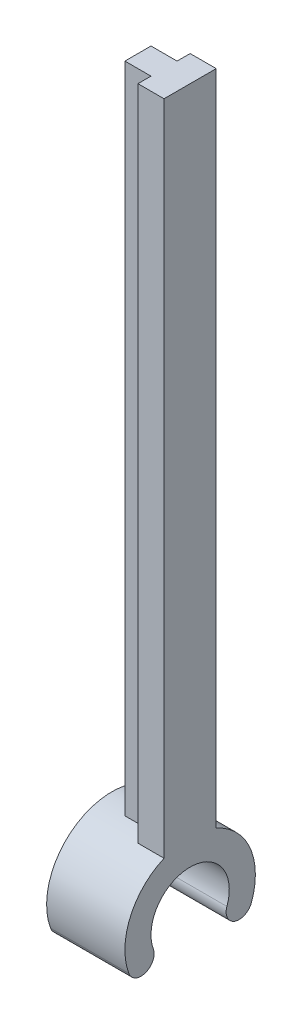
ISO-10303-21;
HEADER;
FILE_DESCRIPTION(('STEP AP214'),'2;1');
FILE_NAME('part.step','',(''),(''),'','','');
FILE_SCHEMA(('AUTOMOTIVE_DESIGN { 1 0 10303 214 1 1 1 1 }'));
ENDSEC;
DATA;
#1=APPLICATION_CONTEXT('core data for automotive mechanical design processes');
#2=APPLICATION_PROTOCOL_DEFINITION('international standard','automotive_design',2000,#1);
#3=PRODUCT_CONTEXT('',#1,'mechanical');
#4=PRODUCT('Part','Part','',(#3));
#5=PRODUCT_RELATED_PRODUCT_CATEGORY('part','',(#4));
#6=PRODUCT_DEFINITION_FORMATION('','',#4);
#7=PRODUCT_DEFINITION_CONTEXT('part definition',#1,'design');
#8=PRODUCT_DEFINITION('design','',#6,#7);
#9=PRODUCT_DEFINITION_SHAPE('','',#8);
#10=(LENGTH_UNIT() NAMED_UNIT(*) SI_UNIT(.MILLI.,.METRE.));
#11=(NAMED_UNIT(*) PLANE_ANGLE_UNIT() SI_UNIT($,.RADIAN.));
#12=(NAMED_UNIT(*) SI_UNIT($,.STERADIAN.) SOLID_ANGLE_UNIT());
#13=UNCERTAINTY_MEASURE_WITH_UNIT(LENGTH_MEASURE(1.E-05),#10,'distance_accuracy_value','');
#14=(GEOMETRIC_REPRESENTATION_CONTEXT(3) GLOBAL_UNCERTAINTY_ASSIGNED_CONTEXT((#13)) GLOBAL_UNIT_ASSIGNED_CONTEXT((#10,
#11,#12)) REPRESENTATION_CONTEXT('',''));
#15=CARTESIAN_POINT('',(0.,0.,0.));
#16=DIRECTION('',(0.,0.,1.));
#17=DIRECTION('',(1.,0.,0.));
#18=AXIS2_PLACEMENT_3D('',#15,#16,#17);
#19=CARTESIAN_POINT('',(2.,0.,0.));
#20=DIRECTION('',(-1.,0.,0.));
#21=DIRECTION('',(0.,0.,1.));
#22=AXIS2_PLACEMENT_3D('',#19,#20,#21);
#23=CYLINDRICAL_SURFACE('',#22,5.);
#24=DIRECTION('',(-1.,0.,0.));
#25=VECTOR('',#24,1.);
#26=CARTESIAN_POINT('',(2.,4.89897948556635,-1.00000000000001));
#27=LINE('',#26,#25);
#28=CARTESIAN_POINT('',(0.,4.89897948556635,-1.00000000000001));
#29=VERTEX_POINT('',#28);
#30=CARTESIAN_POINT('',(-2.,4.89897948556635,-1.00000000000001));
#31=VERTEX_POINT('',#30);
#32=EDGE_CURVE('E155',#29,#31,#27,.T.);
#33=ORIENTED_EDGE('',*,*,#32,.F.);
#34=CARTESIAN_POINT('',(0.,0.,0.));
#35=DIRECTION('',(1.,0.,0.));
#36=DIRECTION('',(0.,0.,-1.));
#37=AXIS2_PLACEMENT_3D('',#34,#35,#36);
#38=CIRCLE('',#37,5.);
#39=CARTESIAN_POINT('',(0.,4.58257569495584,-2.));
#40=VERTEX_POINT('',#39);
#41=EDGE_CURVE('E11',#40,#29,#38,.T.);
#42=ORIENTED_EDGE('',*,*,#41,.F.);
#43=DIRECTION('',(-1.,0.,0.));
#44=VECTOR('',#43,1.);
#45=CARTESIAN_POINT('',(2.,4.58257569495584,-2.));
#46=LINE('',#45,#44);
#47=CARTESIAN_POINT('',(2.,4.58257569495584,-2.));
#48=VERTEX_POINT('',#47);
#49=EDGE_CURVE('E206',#48,#40,#46,.T.);
#50=ORIENTED_EDGE('',*,*,#49,.F.);
#51=CARTESIAN_POINT('',(2.,0.,0.));
#52=DIRECTION('',(1.,0.,0.));
#53=DIRECTION('',(0.,0.,-1.));
#54=AXIS2_PLACEMENT_3D('',#51,#52,#53);
#55=CIRCLE('',#54,5.);
#56=CARTESIAN_POINT('',(2.,-1.71010071662835,-4.69846310392954));
#57=VERTEX_POINT('',#56);
#58=EDGE_CURVE('E234',#57,#48,#55,.T.);
#59=ORIENTED_EDGE('',*,*,#58,.F.);
#60=DIRECTION('',(-1.,0.,0.));
#61=VECTOR('',#60,1.);
#62=CARTESIAN_POINT('',(2.,-1.71010071662835,-4.69846310392954));
#63=LINE('',#62,#61);
#64=CARTESIAN_POINT('',(-4.,-1.71010071662835,-4.69846310392954));
#65=VERTEX_POINT('',#64);
#66=EDGE_CURVE('E248',#57,#65,#63,.T.);
#67=ORIENTED_EDGE('',*,*,#66,.T.);
#68=CARTESIAN_POINT('',(-4.,0.,0.));
#69=DIRECTION('',(1.,0.,0.));
#70=DIRECTION('',(0.,0.,-1.));
#71=AXIS2_PLACEMENT_3D('',#68,#69,#70);
#72=CIRCLE('',#71,5.);
#73=CARTESIAN_POINT('',(-4.,-1.71010071662835,4.69846310392954));
#74=VERTEX_POINT('',#73);
#75=EDGE_CURVE('E218',#65,#74,#72,.T.);
#76=ORIENTED_EDGE('',*,*,#75,.T.);
#77=DIRECTION('',(-1.,0.,0.));
#78=VECTOR('',#77,1.);
#79=CARTESIAN_POINT('',(2.,-1.71010071662835,4.69846310392954));
#80=LINE('',#79,#78);
#81=CARTESIAN_POINT('',(2.,-1.71010071662835,4.69846310392954));
#82=VERTEX_POINT('',#81);
#83=EDGE_CURVE('E245',#82,#74,#80,.T.);
#84=ORIENTED_EDGE('',*,*,#83,.F.);
#85=CARTESIAN_POINT('',(2.,4.58257569495584,2.));
#86=VERTEX_POINT('',#85);
#87=EDGE_CURVE('E233',#86,#82,#55,.T.);
#88=ORIENTED_EDGE('',*,*,#87,.F.);
#89=DIRECTION('',(-1.,0.,0.));
#90=VECTOR('',#89,1.);
#91=CARTESIAN_POINT('',(2.,4.58257569495584,2.));
#92=LINE('',#91,#90);
#93=CARTESIAN_POINT('',(0.,4.58257569495584,2.));
#94=VERTEX_POINT('',#93);
#95=EDGE_CURVE('E202',#86,#94,#92,.T.);
#96=ORIENTED_EDGE('',*,*,#95,.T.);
#97=CARTESIAN_POINT('',(0.,4.89897948556636,0.999999999999994));
#98=VERTEX_POINT('',#97);
#99=EDGE_CURVE('E50',#98,#94,#38,.T.);
#100=ORIENTED_EDGE('',*,*,#99,.F.);
#101=DIRECTION('',(-1.,0.,0.));
#102=VECTOR('',#101,1.);
#103=CARTESIAN_POINT('',(2.,4.89897948556636,0.999999999999994));
#104=LINE('',#103,#102);
#105=CARTESIAN_POINT('',(-2.,4.89897948556636,0.999999999999994));
#106=VERTEX_POINT('',#105);
#107=EDGE_CURVE('E57',#98,#106,#104,.T.);
#108=ORIENTED_EDGE('',*,*,#107,.T.);
#109=CARTESIAN_POINT('',(-2.,0.,0.));
#110=DIRECTION('',(1.,0.,0.));
#111=DIRECTION('',(0.,0.,-1.));
#112=AXIS2_PLACEMENT_3D('',#109,#110,#111);
#113=CIRCLE('',#112,5.);
#114=EDGE_CURVE('E61',#31,#106,#113,.T.);
#115=ORIENTED_EDGE('',*,*,#114,.F.);
#116=EDGE_LOOP('',(#33,#42,#50,#59,#67,#76,#84,#88,#96,#100,#108,#115));
#117=FACE_BOUND('',#116,.T.);
#118=ADVANCED_FACE('F41',(#117),#23,.T.);
#119=CARTESIAN_POINT('',(0.,0.,0.));
#120=DIRECTION('',(1.,0.,0.));
#121=DIRECTION('',(0.,0.,-1.));
#122=AXIS2_PLACEMENT_3D('',#119,#120,#121);
#123=PLANE('',#122);
#124=DIRECTION('',(0.,-1.,0.));
#125=VECTOR('',#124,1.);
#126=CARTESIAN_POINT('',(0.,0.,-1.00000000000001));
#127=LINE('',#126,#125);
#128=CARTESIAN_POINT('',(0.,55.,-1.));
#129=VERTEX_POINT('',#128);
#130=EDGE_CURVE('E160',#129,#29,#127,.T.);
#131=ORIENTED_EDGE('',*,*,#130,.F.);
#132=DIRECTION('',(0.,0.,-1.));
#133=VECTOR('',#132,1.);
#134=CARTESIAN_POINT('',(0.,55.,0.));
#135=LINE('',#134,#133);
#136=CARTESIAN_POINT('',(0.,55.,-2.));
#137=VERTEX_POINT('',#136);
#138=EDGE_CURVE('E147',#129,#137,#135,.T.);
#139=ORIENTED_EDGE('',*,*,#138,.T.);
#140=DIRECTION('',(0.,1.,0.));
#141=VECTOR('',#140,1.);
#142=CARTESIAN_POINT('',(0.,0.,-2.));
#143=LINE('',#142,#141);
#144=EDGE_CURVE('E175',#40,#137,#143,.T.);
#145=ORIENTED_EDGE('',*,*,#144,.F.);
#146=ORIENTED_EDGE('',*,*,#41,.T.);
#147=EDGE_LOOP('',(#131,#139,#145,#146));
#148=FACE_BOUND('',#147,.T.);
#149=ADVANCED_FACE('F277',(#148),#123,.F.);
#150=CARTESIAN_POINT('',(2.,0.,0.));
#151=DIRECTION('',(-1.,0.,0.));
#152=DIRECTION('',(0.,0.,1.));
#153=AXIS2_PLACEMENT_3D('',#150,#151,#152);
#154=CYLINDRICAL_SURFACE('',#153,3.);
#155=DIRECTION('',(-1.,0.,0.));
#156=VECTOR('',#155,1.);
#157=CARTESIAN_POINT('',(2.,-1.02606042997701,2.81907786235773));
#158=LINE('',#157,#156);
#159=CARTESIAN_POINT('',(2.,-1.02606042997701,2.81907786235773));
#160=VERTEX_POINT('',#159);
#161=CARTESIAN_POINT('',(-4.,-1.02606042997701,2.81907786235773));
#162=VERTEX_POINT('',#161);
#163=EDGE_CURVE('E242',#160,#162,#158,.T.);
#164=ORIENTED_EDGE('',*,*,#163,.T.);
#165=CARTESIAN_POINT('',(-4.,0.,0.));
#166=DIRECTION('',(1.,0.,0.));
#167=DIRECTION('',(0.,0.,-1.));
#168=AXIS2_PLACEMENT_3D('',#165,#166,#167);
#169=CIRCLE('',#168,3.);
#170=CARTESIAN_POINT('',(-4.,-1.02606042997701,-2.81907786235773));
#171=VERTEX_POINT('',#170);
#172=EDGE_CURVE('E210',#171,#162,#169,.T.);
#173=ORIENTED_EDGE('',*,*,#172,.F.);
#174=DIRECTION('',(-1.,0.,0.));
#175=VECTOR('',#174,1.);
#176=CARTESIAN_POINT('',(2.,-1.02606042997701,-2.81907786235773));
#177=LINE('',#176,#175);
#178=CARTESIAN_POINT('',(2.,-1.02606042997701,-2.81907786235773));
#179=VERTEX_POINT('',#178);
#180=EDGE_CURVE('E250',#179,#171,#177,.T.);
#181=ORIENTED_EDGE('',*,*,#180,.F.);
#182=CARTESIAN_POINT('',(2.,0.,0.));
#183=DIRECTION('',(1.,0.,0.));
#184=DIRECTION('',(0.,0.,-1.));
#185=AXIS2_PLACEMENT_3D('',#182,#183,#184);
#186=CIRCLE('',#185,3.);
#187=EDGE_CURVE('E226',#179,#160,#186,.T.);
#188=ORIENTED_EDGE('',*,*,#187,.T.);
#189=EDGE_LOOP('',(#164,#173,#181,#188));
#190=FACE_BOUND('',#189,.T.);
#191=ADVANCED_FACE('F43',(#190),#154,.F.);
#192=CARTESIAN_POINT('',(2.,-1.36808057330268,-3.75877048314363));
#193=DIRECTION('',(-1.,0.,0.));
#194=DIRECTION('',(0.,0.,1.));
#195=AXIS2_PLACEMENT_3D('',#192,#193,#194);
#196=CYLINDRICAL_SURFACE('',#195,1.);
#197=ORIENTED_EDGE('',*,*,#180,.T.);
#198=CARTESIAN_POINT('',(-4.,-1.36808057330268,-3.75877048314363));
#199=DIRECTION('',(1.,0.,0.));
#200=DIRECTION('',(0.,0.,-1.));
#201=AXIS2_PLACEMENT_3D('',#198,#199,#200);
#202=CIRCLE('',#201,1.);
#203=EDGE_CURVE('E214',#65,#171,#202,.F.);
#204=ORIENTED_EDGE('',*,*,#203,.F.);
#205=ORIENTED_EDGE('',*,*,#66,.F.);
#206=CARTESIAN_POINT('',(2.,-1.36808057330268,-3.75877048314363));
#207=DIRECTION('',(1.,0.,0.));
#208=DIRECTION('',(0.,0.,-1.));
#209=AXIS2_PLACEMENT_3D('',#206,#207,#208);
#210=CIRCLE('',#209,1.);
#211=EDGE_CURVE('E229',#57,#179,#210,.F.);
#212=ORIENTED_EDGE('',*,*,#211,.T.);
#213=EDGE_LOOP('',(#197,#204,#205,#212));
#214=FACE_BOUND('',#213,.T.);
#215=ADVANCED_FACE('F287',(#214),#196,.T.);
#216=CARTESIAN_POINT('',(2.,-1.36808057330268,3.75877048314363));
#217=DIRECTION('',(-1.,0.,0.));
#218=DIRECTION('',(0.,0.,1.));
#219=AXIS2_PLACEMENT_3D('',#216,#217,#218);
#220=CYLINDRICAL_SURFACE('',#219,1.);
#221=ORIENTED_EDGE('',*,*,#83,.T.);
#222=CARTESIAN_POINT('',(-4.,-1.36808057330268,3.75877048314363));
#223=DIRECTION('',(1.,0.,0.));
#224=DIRECTION('',(0.,0.,-1.));
#225=AXIS2_PLACEMENT_3D('',#222,#223,#224);
#226=CIRCLE('',#225,1.);
#227=EDGE_CURVE('E222',#74,#162,#226,.T.);
#228=ORIENTED_EDGE('',*,*,#227,.T.);
#229=ORIENTED_EDGE('',*,*,#163,.F.);
#230=CARTESIAN_POINT('',(2.,-1.36808057330268,3.75877048314363));
#231=DIRECTION('',(1.,0.,0.));
#232=DIRECTION('',(0.,0.,-1.));
#233=AXIS2_PLACEMENT_3D('',#230,#231,#232);
#234=CIRCLE('',#233,1.);
#235=EDGE_CURVE('E238',#82,#160,#234,.T.);
#236=ORIENTED_EDGE('',*,*,#235,.F.);
#237=EDGE_LOOP('',(#221,#228,#229,#236));
#238=FACE_BOUND('',#237,.T.);
#239=ADVANCED_FACE('F285',(#238),#220,.T.);
#240=CARTESIAN_POINT('',(2.,0.,0.));
#241=DIRECTION('',(1.,0.,0.));
#242=DIRECTION('',(0.,0.,-1.));
#243=AXIS2_PLACEMENT_3D('',#240,#241,#242);
#244=PLANE('',#243);
#245=ORIENTED_EDGE('',*,*,#235,.T.);
#246=ORIENTED_EDGE('',*,*,#187,.F.);
#247=ORIENTED_EDGE('',*,*,#211,.F.);
#248=ORIENTED_EDGE('',*,*,#58,.T.);
#249=DIRECTION('',(0.,1.,0.));
#250=VECTOR('',#249,1.);
#251=CARTESIAN_POINT('',(2.,0.,-2.));
#252=LINE('',#251,#250);
#253=CARTESIAN_POINT('',(2.,55.,-2.));
#254=VERTEX_POINT('',#253);
#255=EDGE_CURVE('E176',#48,#254,#252,.T.);
#256=ORIENTED_EDGE('',*,*,#255,.T.);
#257=DIRECTION('',(0.,0.,-1.));
#258=VECTOR('',#257,1.);
#259=CARTESIAN_POINT('',(2.,55.,0.));
#260=LINE('',#259,#258);
#261=CARTESIAN_POINT('',(2.,55.,2.));
#262=VERTEX_POINT('',#261);
#263=EDGE_CURVE('E179',#262,#254,#260,.T.);
#264=ORIENTED_EDGE('',*,*,#263,.F.);
#265=DIRECTION('',(0.,1.,0.));
#266=VECTOR('',#265,1.);
#267=CARTESIAN_POINT('',(2.,0.,2.));
#268=LINE('',#267,#266);
#269=EDGE_CURVE('E184',#86,#262,#268,.T.);
#270=ORIENTED_EDGE('',*,*,#269,.F.);
#271=ORIENTED_EDGE('',*,*,#87,.T.);
#272=EDGE_LOOP('',(#245,#246,#247,#248,#256,#264,#270,#271));
#273=FACE_BOUND('',#272,.T.);
#274=ADVANCED_FACE('F293',(#273),#244,.T.);
#275=CARTESIAN_POINT('',(-4.,0.,0.));
#276=DIRECTION('',(1.,0.,0.));
#277=DIRECTION('',(0.,0.,-1.));
#278=AXIS2_PLACEMENT_3D('',#275,#276,#277);
#279=PLANE('',#278);
#280=ORIENTED_EDGE('',*,*,#172,.T.);
#281=ORIENTED_EDGE('',*,*,#227,.F.);
#282=ORIENTED_EDGE('',*,*,#75,.F.);
#283=ORIENTED_EDGE('',*,*,#203,.T.);
#284=EDGE_LOOP('',(#280,#281,#282,#283));
#285=FACE_BOUND('',#284,.T.);
#286=ADVANCED_FACE('F304',(#285),#279,.F.);
#287=CARTESIAN_POINT('',(2.,0.,-2.));
#288=DIRECTION('',(0.,0.,1.));
#289=DIRECTION('',(1.,0.,0.));
#290=AXIS2_PLACEMENT_3D('',#287,#288,#289);
#291=PLANE('',#290);
#292=ORIENTED_EDGE('',*,*,#255,.F.);
#293=ORIENTED_EDGE('',*,*,#49,.T.);
#294=ORIENTED_EDGE('',*,*,#144,.T.);
#295=DIRECTION('',(-1.,0.,0.));
#296=VECTOR('',#295,1.);
#297=CARTESIAN_POINT('',(2.,55.,-2.));
#298=LINE('',#297,#296);
#299=EDGE_CURVE('E199',#254,#137,#298,.T.);
#300=ORIENTED_EDGE('',*,*,#299,.F.);
#301=EDGE_LOOP('',(#292,#293,#294,#300));
#302=FACE_BOUND('',#301,.T.);
#303=ADVANCED_FACE('F315',(#302),#291,.F.);
#304=CARTESIAN_POINT('',(2.,0.,2.));
#305=DIRECTION('',(0.,0.,1.));
#306=DIRECTION('',(0.,-1.,0.));
#307=AXIS2_PLACEMENT_3D('',#304,#305,#306);
#308=PLANE('',#307);
#309=ORIENTED_EDGE('',*,*,#95,.F.);
#310=ORIENTED_EDGE('',*,*,#269,.T.);
#311=DIRECTION('',(-1.,0.,0.));
#312=VECTOR('',#311,1.);
#313=CARTESIAN_POINT('',(2.,55.,2.));
#314=LINE('',#313,#312);
#315=CARTESIAN_POINT('',(0.,55.,2.));
#316=VERTEX_POINT('',#315);
#317=EDGE_CURVE('E187',#262,#316,#314,.T.);
#318=ORIENTED_EDGE('',*,*,#317,.T.);
#319=DIRECTION('',(0.,1.,0.));
#320=VECTOR('',#319,1.);
#321=CARTESIAN_POINT('',(0.,0.,2.));
#322=LINE('',#321,#320);
#323=EDGE_CURVE('E180',#94,#316,#322,.T.);
#324=ORIENTED_EDGE('',*,*,#323,.F.);
#325=EDGE_LOOP('',(#309,#310,#318,#324));
#326=FACE_BOUND('',#325,.T.);
#327=ADVANCED_FACE('F263',(#326),#308,.T.);
#328=CARTESIAN_POINT('',(2.,55.,0.));
#329=DIRECTION('',(0.,1.,0.));
#330=DIRECTION('',(0.,0.,1.));
#331=AXIS2_PLACEMENT_3D('',#328,#329,#330);
#332=PLANE('',#331);
#333=CARTESIAN_POINT('',(0.,55.,1.));
#334=VERTEX_POINT('',#333);
#335=EDGE_CURVE('E191',#316,#334,#135,.T.);
#336=ORIENTED_EDGE('',*,*,#335,.F.);
#337=ORIENTED_EDGE('',*,*,#317,.F.);
#338=ORIENTED_EDGE('',*,*,#263,.T.);
#339=ORIENTED_EDGE('',*,*,#299,.T.);
#340=ORIENTED_EDGE('',*,*,#138,.F.);
#341=DIRECTION('',(1.,0.,0.));
#342=VECTOR('',#341,1.);
#343=CARTESIAN_POINT('',(-2.,55.,-1.));
#344=LINE('',#343,#342);
#345=CARTESIAN_POINT('',(-2.,55.,-1.));
#346=VERTEX_POINT('',#345);
#347=EDGE_CURVE('E143',#346,#129,#344,.T.);
#348=ORIENTED_EDGE('',*,*,#347,.F.);
#349=DIRECTION('',(0.,0.,-1.));
#350=VECTOR('',#349,1.);
#351=CARTESIAN_POINT('',(-2.,55.,0.));
#352=LINE('',#351,#350);
#353=CARTESIAN_POINT('',(-2.,55.,1.));
#354=VERTEX_POINT('',#353);
#355=EDGE_CURVE('E131',#354,#346,#352,.T.);
#356=ORIENTED_EDGE('',*,*,#355,.F.);
#357=DIRECTION('',(1.,0.,0.));
#358=VECTOR('',#357,1.);
#359=CARTESIAN_POINT('',(-2.,55.,1.));
#360=LINE('',#359,#358);
#361=EDGE_CURVE('E152',#354,#334,#360,.T.);
#362=ORIENTED_EDGE('',*,*,#361,.T.);
#363=EDGE_LOOP('',(#336,#337,#338,#339,#340,#348,#356,#362));
#364=FACE_BOUND('',#363,.T.);
#365=ADVANCED_FACE('F145',(#364),#332,.T.);
#366=ORIENTED_EDGE('',*,*,#335,.T.);
#367=DIRECTION('',(0.,-1.,0.));
#368=VECTOR('',#367,1.);
#369=CARTESIAN_POINT('',(0.,0.,0.999999999999993));
#370=LINE('',#369,#368);
#371=EDGE_CURVE('E157',#334,#98,#370,.T.);
#372=ORIENTED_EDGE('',*,*,#371,.T.);
#373=ORIENTED_EDGE('',*,*,#99,.T.);
#374=ORIENTED_EDGE('',*,*,#323,.T.);
#375=EDGE_LOOP('',(#366,#372,#373,#374));
#376=FACE_BOUND('',#375,.T.);
#377=ADVANCED_FACE('F256',(#376),#123,.F.);
#378=CARTESIAN_POINT('',(-2.,0.,-1.00000000000001));
#379=DIRECTION('',(0.,0.,1.));
#380=DIRECTION('',(0.,-1.,0.));
#381=AXIS2_PLACEMENT_3D('',#378,#379,#380);
#382=PLANE('',#381);
#383=ORIENTED_EDGE('',*,*,#130,.T.);
#384=ORIENTED_EDGE('',*,*,#32,.T.);
#385=DIRECTION('',(0.,-1.,0.));
#386=VECTOR('',#385,1.);
#387=CARTESIAN_POINT('',(-2.,0.,-1.00000000000001));
#388=LINE('',#387,#386);
#389=EDGE_CURVE('E135',#346,#31,#388,.T.);
#390=ORIENTED_EDGE('',*,*,#389,.F.);
#391=ORIENTED_EDGE('',*,*,#347,.T.);
#392=EDGE_LOOP('',(#383,#384,#390,#391));
#393=FACE_BOUND('',#392,.T.);
#394=ADVANCED_FACE('F154',(#393),#382,.F.);
#395=CARTESIAN_POINT('',(-2.,0.,0.999999999999993));
#396=DIRECTION('',(0.,0.,1.));
#397=DIRECTION('',(0.,-1.,0.));
#398=AXIS2_PLACEMENT_3D('',#395,#396,#397);
#399=PLANE('',#398);
#400=ORIENTED_EDGE('',*,*,#107,.F.);
#401=ORIENTED_EDGE('',*,*,#371,.F.);
#402=ORIENTED_EDGE('',*,*,#361,.F.);
#403=DIRECTION('',(0.,-1.,0.));
#404=VECTOR('',#403,1.);
#405=CARTESIAN_POINT('',(-2.,0.,0.999999999999993));
#406=LINE('',#405,#404);
#407=EDGE_CURVE('E137',#354,#106,#406,.T.);
#408=ORIENTED_EDGE('',*,*,#407,.T.);
#409=EDGE_LOOP('',(#400,#401,#402,#408));
#410=FACE_BOUND('',#409,.T.);
#411=ADVANCED_FACE('F267',(#410),#399,.T.);
#412=CARTESIAN_POINT('',(-2.,0.,0.));
#413=DIRECTION('',(1.,0.,0.));
#414=DIRECTION('',(0.,0.,-1.));
#415=AXIS2_PLACEMENT_3D('',#412,#413,#414);
#416=PLANE('',#415);
#417=ORIENTED_EDGE('',*,*,#389,.T.);
#418=ORIENTED_EDGE('',*,*,#114,.T.);
#419=ORIENTED_EDGE('',*,*,#407,.F.);
#420=ORIENTED_EDGE('',*,*,#355,.T.);
#421=EDGE_LOOP('',(#417,#418,#419,#420));
#422=FACE_BOUND('',#421,.T.);
#423=ADVANCED_FACE('F133',(#422),#416,.F.);
#424=CLOSED_SHELL('',(#118,#149,#191,#215,#239,#274,#286,#303,#327,#365,#377,#394,#411,#423));
#425=MANIFOLD_SOLID_BREP('B2',#424);
#426=ADVANCED_BREP_SHAPE_REPRESENTATION('',(#18,#425),#14);
#427=SHAPE_DEFINITION_REPRESENTATION(#9,#426);
ENDSEC;
END-ISO-10303-21;
